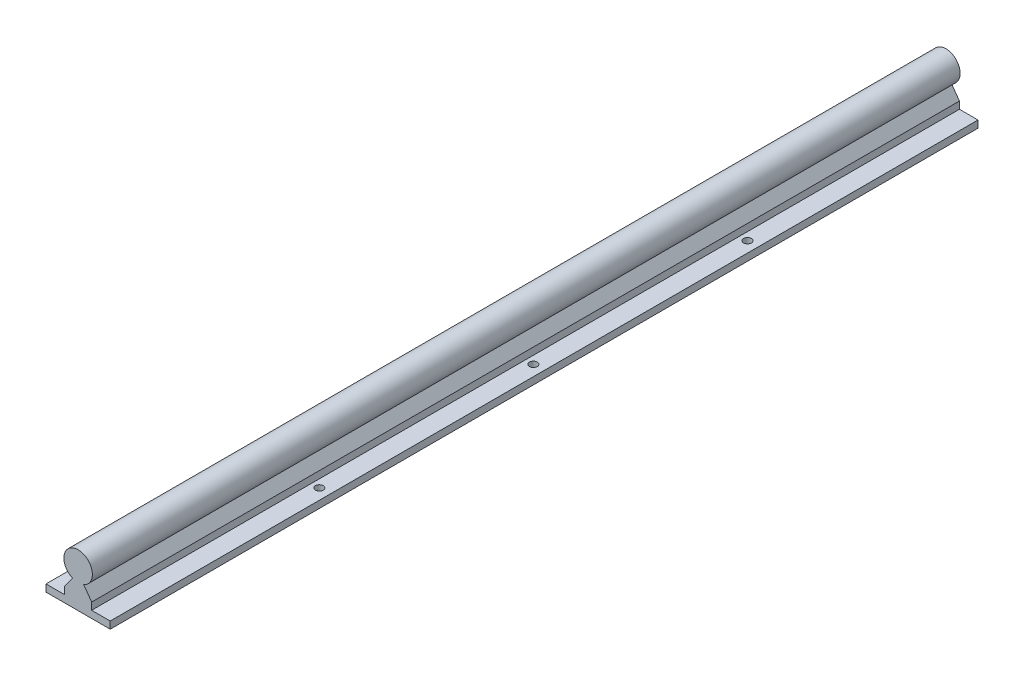
ISO-10303-21;
HEADER;
FILE_DESCRIPTION(('STEP AP214'),'2;1');
FILE_NAME('part.step','',(''),(''),'','','');
FILE_SCHEMA(('AUTOMOTIVE_DESIGN { 1 0 10303 214 1 1 1 1 }'));
ENDSEC;
DATA;
#1=APPLICATION_CONTEXT('core data for automotive mechanical design processes');
#2=APPLICATION_PROTOCOL_DEFINITION('international standard','automotive_design',2000,#1);
#3=PRODUCT_CONTEXT('',#1,'mechanical');
#4=PRODUCT('Part','Part','',(#3));
#5=PRODUCT_RELATED_PRODUCT_CATEGORY('part','',(#4));
#6=PRODUCT_DEFINITION_FORMATION('','',#4);
#7=PRODUCT_DEFINITION_CONTEXT('part definition',#1,'design');
#8=PRODUCT_DEFINITION('design','',#6,#7);
#9=PRODUCT_DEFINITION_SHAPE('','',#8);
#10=(LENGTH_UNIT() NAMED_UNIT(*) SI_UNIT(.MILLI.,.METRE.));
#11=(NAMED_UNIT(*) PLANE_ANGLE_UNIT() SI_UNIT($,.RADIAN.));
#12=(NAMED_UNIT(*) SI_UNIT($,.STERADIAN.) SOLID_ANGLE_UNIT());
#13=UNCERTAINTY_MEASURE_WITH_UNIT(LENGTH_MEASURE(1.E-05),#10,'distance_accuracy_value','');
#14=(GEOMETRIC_REPRESENTATION_CONTEXT(3) GLOBAL_UNCERTAINTY_ASSIGNED_CONTEXT((#13)) GLOBAL_UNIT_ASSIGNED_CONTEXT((#10,
#11,#12)) REPRESENTATION_CONTEXT('',''));
#15=CARTESIAN_POINT('',(0.,0.,0.));
#16=DIRECTION('',(0.,0.,1.));
#17=DIRECTION('',(1.,0.,0.));
#18=AXIS2_PLACEMENT_3D('',#15,#16,#17);
#19=CARTESIAN_POINT('',(0.,27.,608.));
#20=DIRECTION('',(0.,0.,-1.));
#21=DIRECTION('',(-1.,0.,0.));
#22=AXIS2_PLACEMENT_3D('',#19,#20,#21);
#23=CYLINDRICAL_SURFACE('',#22,10.);
#24=CARTESIAN_POINT('',(0.,27.,0.));
#25=DIRECTION('',(0.,0.,1.));
#26=DIRECTION('',(1.,0.,0.));
#27=AXIS2_PLACEMENT_3D('',#24,#25,#26);
#28=CIRCLE('',#27,10.);
#29=CARTESIAN_POINT('',(3.67559518989783,17.7,0.));
#30=VERTEX_POINT('',#29);
#31=CARTESIAN_POINT('',(-3.67559518989783,17.7,0.));
#32=VERTEX_POINT('',#31);
#33=EDGE_CURVE('E160',#30,#32,#28,.T.);
#34=ORIENTED_EDGE('',*,*,#33,.T.);
#35=DIRECTION('',(0.,0.,-1.));
#36=VECTOR('',#35,1.);
#37=CARTESIAN_POINT('',(-3.67559518989783,17.7,608.));
#38=LINE('',#37,#36);
#39=CARTESIAN_POINT('',(-3.67559518989783,17.7,608.));
#40=VERTEX_POINT('',#39);
#41=EDGE_CURVE('E11',#40,#32,#38,.T.);
#42=ORIENTED_EDGE('',*,*,#41,.F.);
#43=CARTESIAN_POINT('',(0.,27.,608.));
#44=DIRECTION('',(0.,0.,1.));
#45=DIRECTION('',(1.,0.,0.));
#46=AXIS2_PLACEMENT_3D('',#43,#44,#45);
#47=CIRCLE('',#46,10.);
#48=CARTESIAN_POINT('',(3.67559518989783,17.7,608.));
#49=VERTEX_POINT('',#48);
#50=EDGE_CURVE('E189',#49,#40,#47,.T.);
#51=ORIENTED_EDGE('',*,*,#50,.F.);
#52=DIRECTION('',(0.,0.,-1.));
#53=VECTOR('',#52,1.);
#54=CARTESIAN_POINT('',(3.67559518989783,17.7,608.));
#55=LINE('',#54,#53);
#56=EDGE_CURVE('E56',#49,#30,#55,.T.);
#57=ORIENTED_EDGE('',*,*,#56,.T.);
#58=EDGE_LOOP('',(#34,#42,#51,#57));
#59=FACE_BOUND('',#58,.T.);
#60=ADVANCED_FACE('F38',(#59),#23,.T.);
#61=CARTESIAN_POINT('',(0.,17.7,608.));
#62=DIRECTION('',(0.,-1.,0.));
#63=DIRECTION('',(0.,0.,-1.));
#64=AXIS2_PLACEMENT_3D('',#61,#62,#63);
#65=PLANE('',#64);
#66=DIRECTION('',(-1.,0.,0.));
#67=VECTOR('',#66,1.);
#68=CARTESIAN_POINT('',(0.,17.7,0.));
#69=LINE('',#68,#67);
#70=CARTESIAN_POINT('',(-4.,17.7,0.));
#71=VERTEX_POINT('',#70);
#72=EDGE_CURVE('E162',#32,#71,#69,.T.);
#73=ORIENTED_EDGE('',*,*,#72,.T.);
#74=DIRECTION('',(0.,0.,-1.));
#75=VECTOR('',#74,1.);
#76=CARTESIAN_POINT('',(-4.,17.7,608.));
#77=LINE('',#76,#75);
#78=CARTESIAN_POINT('',(-4.,17.7,608.));
#79=VERTEX_POINT('',#78);
#80=EDGE_CURVE('E47',#79,#71,#77,.T.);
#81=ORIENTED_EDGE('',*,*,#80,.F.);
#82=DIRECTION('',(-1.,0.,0.));
#83=VECTOR('',#82,1.);
#84=CARTESIAN_POINT('',(0.,17.7,608.));
#85=LINE('',#84,#83);
#86=EDGE_CURVE('E106',#40,#79,#85,.T.);
#87=ORIENTED_EDGE('',*,*,#86,.F.);
#88=ORIENTED_EDGE('',*,*,#41,.T.);
#89=EDGE_LOOP('',(#73,#81,#87,#88));
#90=FACE_BOUND('',#89,.T.);
#91=ADVANCED_FACE('F272',(#90),#65,.F.);
#92=CARTESIAN_POINT('',(-11.0202702702703,7.87162162162162,608.));
#93=DIRECTION('',(0.813733471206735,-0.581238193719096,0.));
#94=DIRECTION('',(0.581238193719096,0.813733471206735,0.));
#95=AXIS2_PLACEMENT_3D('',#92,#93,#94);
#96=PLANE('',#95);
#97=DIRECTION('',(-0.581238193719096,-0.813733471206735,0.));
#98=VECTOR('',#97,1.);
#99=CARTESIAN_POINT('',(-11.0202702702703,7.87162162162162,0.));
#100=LINE('',#99,#98);
#101=CARTESIAN_POINT('',(-9.5,10.,0.));
#102=VERTEX_POINT('',#101);
#103=EDGE_CURVE('E165',#71,#102,#100,.T.);
#104=ORIENTED_EDGE('',*,*,#103,.T.);
#105=DIRECTION('',(0.,0.,-1.));
#106=VECTOR('',#105,1.);
#107=CARTESIAN_POINT('',(-9.5,10.,608.));
#108=LINE('',#107,#106);
#109=CARTESIAN_POINT('',(-9.5,10.,608.));
#110=VERTEX_POINT('',#109);
#111=EDGE_CURVE('E205',#110,#102,#108,.T.);
#112=ORIENTED_EDGE('',*,*,#111,.F.);
#113=DIRECTION('',(-0.581238193719096,-0.813733471206735,0.));
#114=VECTOR('',#113,1.);
#115=CARTESIAN_POINT('',(-11.0202702702703,7.87162162162162,608.));
#116=LINE('',#115,#114);
#117=EDGE_CURVE('E235',#79,#110,#116,.T.);
#118=ORIENTED_EDGE('',*,*,#117,.F.);
#119=ORIENTED_EDGE('',*,*,#80,.T.);
#120=EDGE_LOOP('',(#104,#112,#118,#119));
#121=FACE_BOUND('',#120,.T.);
#122=ADVANCED_FACE('F276',(#121),#96,.F.);
#123=CARTESIAN_POINT('',(-9.5,0.,608.));
#124=DIRECTION('',(1.,0.,0.));
#125=DIRECTION('',(0.,1.,0.));
#126=AXIS2_PLACEMENT_3D('',#123,#124,#125);
#127=PLANE('',#126);
#128=DIRECTION('',(0.,-1.,0.));
#129=VECTOR('',#128,1.);
#130=CARTESIAN_POINT('',(-9.5,0.,0.));
#131=LINE('',#130,#129);
#132=CARTESIAN_POINT('',(-9.5,5.,0.));
#133=VERTEX_POINT('',#132);
#134=EDGE_CURVE('E167',#102,#133,#131,.T.);
#135=ORIENTED_EDGE('',*,*,#134,.T.);
#136=DIRECTION('',(0.,0.,-1.));
#137=VECTOR('',#136,1.);
#138=CARTESIAN_POINT('',(-9.5,5.,608.));
#139=LINE('',#138,#137);
#140=CARTESIAN_POINT('',(-9.5,5.,608.));
#141=VERTEX_POINT('',#140);
#142=EDGE_CURVE('E203',#141,#133,#139,.T.);
#143=ORIENTED_EDGE('',*,*,#142,.F.);
#144=DIRECTION('',(0.,-1.,0.));
#145=VECTOR('',#144,1.);
#146=CARTESIAN_POINT('',(-9.5,0.,608.));
#147=LINE('',#146,#145);
#148=EDGE_CURVE('E237',#110,#141,#147,.T.);
#149=ORIENTED_EDGE('',*,*,#148,.F.);
#150=ORIENTED_EDGE('',*,*,#111,.T.);
#151=EDGE_LOOP('',(#135,#143,#149,#150));
#152=FACE_BOUND('',#151,.T.);
#153=ADVANCED_FACE('F286',(#152),#127,.F.);
#154=CARTESIAN_POINT('',(0.,5.,608.));
#155=DIRECTION('',(0.,1.,0.));
#156=DIRECTION('',(-1.,0.,0.));
#157=AXIS2_PLACEMENT_3D('',#154,#155,#156);
#158=PLANE('',#157);
#159=CARTESIAN_POINT('',(-15.0000000000037,5.,154.));
#160=DIRECTION('',(0.,1.,0.));
#161=DIRECTION('',(-1.,0.,0.));
#162=AXIS2_PLACEMENT_3D('',#159,#160,#161);
#163=CIRCLE('',#162,2.75);
#164=CARTESIAN_POINT('',(-17.7500000000037,5.,154.));
#165=VERTEX_POINT('',#164);
#166=EDGE_CURVE('E163',#165,#165,#163,.F.);
#167=ORIENTED_EDGE('',*,*,#166,.T.);
#168=EDGE_LOOP('',(#167));
#169=FACE_BOUND('',#168,.T.);
#170=CARTESIAN_POINT('',(-15.0000000000032,5.,304.));
#171=DIRECTION('',(0.,1.,0.));
#172=DIRECTION('',(-1.,0.,0.));
#173=AXIS2_PLACEMENT_3D('',#170,#171,#172);
#174=CIRCLE('',#173,2.74999999999999);
#175=CARTESIAN_POINT('',(-17.7500000000032,5.,304.));
#176=VERTEX_POINT('',#175);
#177=EDGE_CURVE('E222',#176,#176,#174,.F.);
#178=ORIENTED_EDGE('',*,*,#177,.T.);
#179=EDGE_LOOP('',(#178));
#180=FACE_BOUND('',#179,.T.);
#181=CARTESIAN_POINT('',(-15.0000000000016,5.,454.));
#182=DIRECTION('',(0.,1.,0.));
#183=DIRECTION('',(-1.,0.,0.));
#184=AXIS2_PLACEMENT_3D('',#181,#182,#183);
#185=CIRCLE('',#184,2.74999999999997);
#186=CARTESIAN_POINT('',(-17.7500000000016,5.,454.));
#187=VERTEX_POINT('',#186);
#188=EDGE_CURVE('E218',#187,#187,#185,.F.);
#189=ORIENTED_EDGE('',*,*,#188,.T.);
#190=EDGE_LOOP('',(#189));
#191=FACE_BOUND('',#190,.T.);
#192=DIRECTION('',(1.,0.,0.));
#193=VECTOR('',#192,1.);
#194=CARTESIAN_POINT('',(0.,5.,0.));
#195=LINE('',#194,#193);
#196=CARTESIAN_POINT('',(-22.5,5.,0.));
#197=VERTEX_POINT('',#196);
#198=EDGE_CURVE('E170',#197,#133,#195,.T.);
#199=ORIENTED_EDGE('',*,*,#198,.F.);
#200=DIRECTION('',(0.,0.,-1.));
#201=VECTOR('',#200,1.);
#202=CARTESIAN_POINT('',(-22.5,5.,608.));
#203=LINE('',#202,#201);
#204=CARTESIAN_POINT('',(-22.5,5.,608.));
#205=VERTEX_POINT('',#204);
#206=EDGE_CURVE('E201',#205,#197,#203,.T.);
#207=ORIENTED_EDGE('',*,*,#206,.F.);
#208=DIRECTION('',(1.,0.,0.));
#209=VECTOR('',#208,1.);
#210=CARTESIAN_POINT('',(0.,5.,608.));
#211=LINE('',#210,#209);
#212=EDGE_CURVE('E239',#205,#141,#211,.T.);
#213=ORIENTED_EDGE('',*,*,#212,.T.);
#214=ORIENTED_EDGE('',*,*,#142,.T.);
#215=EDGE_LOOP('',(#199,#207,#213,#214));
#216=FACE_BOUND('',#215,.T.);
#217=ADVANCED_FACE('F304',(#169,#180,#191,#216),#158,.T.);
#218=CARTESIAN_POINT('',(-22.5,0.,608.));
#219=DIRECTION('',(-1.,0.,0.));
#220=DIRECTION('',(0.,0.,1.));
#221=AXIS2_PLACEMENT_3D('',#218,#219,#220);
#222=PLANE('',#221);
#223=DIRECTION('',(0.,1.,0.));
#224=VECTOR('',#223,1.);
#225=CARTESIAN_POINT('',(-22.5,0.,0.));
#226=LINE('',#225,#224);
#227=CARTESIAN_POINT('',(-22.5,0.,0.));
#228=VERTEX_POINT('',#227);
#229=EDGE_CURVE('E173',#228,#197,#226,.T.);
#230=ORIENTED_EDGE('',*,*,#229,.F.);
#231=DIRECTION('',(0.,0.,-1.));
#232=VECTOR('',#231,1.);
#233=CARTESIAN_POINT('',(-22.5,0.,608.));
#234=LINE('',#233,#232);
#235=CARTESIAN_POINT('',(-22.5,0.,608.));
#236=VERTEX_POINT('',#235);
#237=EDGE_CURVE('E199',#236,#228,#234,.T.);
#238=ORIENTED_EDGE('',*,*,#237,.F.);
#239=DIRECTION('',(0.,1.,0.));
#240=VECTOR('',#239,1.);
#241=CARTESIAN_POINT('',(-22.5,0.,608.));
#242=LINE('',#241,#240);
#243=EDGE_CURVE('E242',#236,#205,#242,.T.);
#244=ORIENTED_EDGE('',*,*,#243,.T.);
#245=ORIENTED_EDGE('',*,*,#206,.T.);
#246=EDGE_LOOP('',(#230,#238,#244,#245));
#247=FACE_BOUND('',#246,.T.);
#248=ADVANCED_FACE('F292',(#247),#222,.T.);
#249=CARTESIAN_POINT('',(0.,0.,608.));
#250=DIRECTION('',(0.,1.,0.));
#251=DIRECTION('',(0.,0.,1.));
#252=AXIS2_PLACEMENT_3D('',#249,#250,#251);
#253=PLANE('',#252);
#254=CARTESIAN_POINT('',(14.9999999999968,0.,304.));
#255=DIRECTION('',(0.,1.,0.));
#256=DIRECTION('',(0.,0.,1.));
#257=AXIS2_PLACEMENT_3D('',#254,#255,#256);
#258=CIRCLE('',#257,2.75000000000003);
#259=CARTESIAN_POINT('',(14.9999999999968,0.,306.75));
#260=VERTEX_POINT('',#259);
#261=EDGE_CURVE('E466',#260,#260,#258,.T.);
#262=ORIENTED_EDGE('',*,*,#261,.T.);
#263=EDGE_LOOP('',(#262));
#264=FACE_BOUND('',#263,.T.);
#265=CARTESIAN_POINT('',(14.9999999999963,0.,154.));
#266=DIRECTION('',(0.,1.,0.));
#267=DIRECTION('',(0.,0.,1.));
#268=AXIS2_PLACEMENT_3D('',#265,#266,#267);
#269=CIRCLE('',#268,2.75000000000002);
#270=CARTESIAN_POINT('',(14.9999999999963,0.,156.75));
#271=VERTEX_POINT('',#270);
#272=EDGE_CURVE('E460',#271,#271,#269,.T.);
#273=ORIENTED_EDGE('',*,*,#272,.T.);
#274=EDGE_LOOP('',(#273));
#275=FACE_BOUND('',#274,.T.);
#276=CARTESIAN_POINT('',(-15.0000000000037,0.,154.));
#277=DIRECTION('',(0.,1.,0.));
#278=DIRECTION('',(0.,0.,1.));
#279=AXIS2_PLACEMENT_3D('',#276,#277,#278);
#280=CIRCLE('',#279,2.75);
#281=CARTESIAN_POINT('',(-15.0000000000037,0.,156.75));
#282=VERTEX_POINT('',#281);
#283=EDGE_CURVE('E457',#282,#282,#280,.T.);
#284=ORIENTED_EDGE('',*,*,#283,.T.);
#285=EDGE_LOOP('',(#284));
#286=FACE_BOUND('',#285,.T.);
#287=CARTESIAN_POINT('',(-15.0000000000032,0.,304.));
#288=DIRECTION('',(0.,1.,0.));
#289=DIRECTION('',(0.,0.,1.));
#290=AXIS2_PLACEMENT_3D('',#287,#288,#289);
#291=CIRCLE('',#290,2.74999999999999);
#292=CARTESIAN_POINT('',(-15.0000000000032,0.,306.75));
#293=VERTEX_POINT('',#292);
#294=EDGE_CURVE('E459',#293,#293,#291,.T.);
#295=ORIENTED_EDGE('',*,*,#294,.T.);
#296=EDGE_LOOP('',(#295));
#297=FACE_BOUND('',#296,.T.);
#298=CARTESIAN_POINT('',(-15.0000000000016,0.,454.));
#299=DIRECTION('',(0.,1.,0.));
#300=DIRECTION('',(0.,0.,1.));
#301=AXIS2_PLACEMENT_3D('',#298,#299,#300);
#302=CIRCLE('',#301,2.74999999999997);
#303=CARTESIAN_POINT('',(-15.0000000000016,0.,456.75));
#304=VERTEX_POINT('',#303);
#305=EDGE_CURVE('E463',#304,#304,#302,.T.);
#306=ORIENTED_EDGE('',*,*,#305,.T.);
#307=EDGE_LOOP('',(#306));
#308=FACE_BOUND('',#307,.T.);
#309=CARTESIAN_POINT('',(14.9999999999984,0.,454.));
#310=DIRECTION('',(0.,1.,0.));
#311=DIRECTION('',(0.,0.,1.));
#312=AXIS2_PLACEMENT_3D('',#309,#310,#311);
#313=CIRCLE('',#312,2.74999999999998);
#314=CARTESIAN_POINT('',(14.9999999999984,0.,456.75));
#315=VERTEX_POINT('',#314);
#316=EDGE_CURVE('E213',#315,#315,#313,.T.);
#317=ORIENTED_EDGE('',*,*,#316,.T.);
#318=EDGE_LOOP('',(#317));
#319=FACE_BOUND('',#318,.T.);
#320=DIRECTION('',(1.,0.,0.));
#321=VECTOR('',#320,1.);
#322=CARTESIAN_POINT('',(0.,0.,0.));
#323=LINE('',#322,#321);
#324=CARTESIAN_POINT('',(22.5,0.,0.));
#325=VERTEX_POINT('',#324);
#326=EDGE_CURVE('E176',#228,#325,#323,.T.);
#327=ORIENTED_EDGE('',*,*,#326,.T.);
#328=DIRECTION('',(0.,0.,-1.));
#329=VECTOR('',#328,1.);
#330=CARTESIAN_POINT('',(22.5,0.,608.));
#331=LINE('',#330,#329);
#332=CARTESIAN_POINT('',(22.5,0.,608.));
#333=VERTEX_POINT('',#332);
#334=EDGE_CURVE('E196',#333,#325,#331,.T.);
#335=ORIENTED_EDGE('',*,*,#334,.F.);
#336=DIRECTION('',(1.,0.,0.));
#337=VECTOR('',#336,1.);
#338=CARTESIAN_POINT('',(0.,0.,608.));
#339=LINE('',#338,#337);
#340=EDGE_CURVE('E245',#236,#333,#339,.T.);
#341=ORIENTED_EDGE('',*,*,#340,.F.);
#342=ORIENTED_EDGE('',*,*,#237,.T.);
#343=EDGE_LOOP('',(#327,#335,#341,#342));
#344=FACE_BOUND('',#343,.T.);
#345=ADVANCED_FACE('F295',(#264,#275,#286,#297,#308,#319,#344),#253,.F.);
#346=CARTESIAN_POINT('',(22.5,0.,608.));
#347=DIRECTION('',(-1.,0.,0.));
#348=DIRECTION('',(0.,0.,1.));
#349=AXIS2_PLACEMENT_3D('',#346,#347,#348);
#350=PLANE('',#349);
#351=DIRECTION('',(0.,1.,0.));
#352=VECTOR('',#351,1.);
#353=CARTESIAN_POINT('',(22.5,0.,0.));
#354=LINE('',#353,#352);
#355=CARTESIAN_POINT('',(22.5,5.,0.));
#356=VERTEX_POINT('',#355);
#357=EDGE_CURVE('E178',#325,#356,#354,.T.);
#358=ORIENTED_EDGE('',*,*,#357,.T.);
#359=DIRECTION('',(0.,0.,-1.));
#360=VECTOR('',#359,1.);
#361=CARTESIAN_POINT('',(22.5,5.,608.));
#362=LINE('',#361,#360);
#363=CARTESIAN_POINT('',(22.5,5.,608.));
#364=VERTEX_POINT('',#363);
#365=EDGE_CURVE('E193',#364,#356,#362,.T.);
#366=ORIENTED_EDGE('',*,*,#365,.F.);
#367=DIRECTION('',(0.,1.,0.));
#368=VECTOR('',#367,1.);
#369=CARTESIAN_POINT('',(22.5,0.,608.));
#370=LINE('',#369,#368);
#371=EDGE_CURVE('E247',#333,#364,#370,.T.);
#372=ORIENTED_EDGE('',*,*,#371,.F.);
#373=ORIENTED_EDGE('',*,*,#334,.T.);
#374=EDGE_LOOP('',(#358,#366,#372,#373));
#375=FACE_BOUND('',#374,.T.);
#376=ADVANCED_FACE('F254',(#375),#350,.F.);
#377=CARTESIAN_POINT('',(0.,5.,608.));
#378=DIRECTION('',(0.,-1.,0.));
#379=DIRECTION('',(1.,0.,0.));
#380=AXIS2_PLACEMENT_3D('',#377,#378,#379);
#381=PLANE('',#380);
#382=CARTESIAN_POINT('',(14.9999999999968,5.,304.));
#383=DIRECTION('',(0.,-1.,0.));
#384=DIRECTION('',(1.,0.,0.));
#385=AXIS2_PLACEMENT_3D('',#382,#383,#384);
#386=CIRCLE('',#385,2.75000000000003);
#387=CARTESIAN_POINT('',(17.7499999999968,5.,304.));
#388=VERTEX_POINT('',#387);
#389=EDGE_CURVE('E41',#388,#388,#386,.F.);
#390=ORIENTED_EDGE('',*,*,#389,.F.);
#391=EDGE_LOOP('',(#390));
#392=FACE_BOUND('',#391,.T.);
#393=CARTESIAN_POINT('',(14.9999999999963,5.,154.));
#394=DIRECTION('',(0.,-1.,0.));
#395=DIRECTION('',(1.,0.,0.));
#396=AXIS2_PLACEMENT_3D('',#393,#394,#395);
#397=CIRCLE('',#396,2.75000000000002);
#398=CARTESIAN_POINT('',(17.7499999999963,5.,154.));
#399=VERTEX_POINT('',#398);
#400=EDGE_CURVE('E212',#399,#399,#397,.F.);
#401=ORIENTED_EDGE('',*,*,#400,.F.);
#402=EDGE_LOOP('',(#401));
#403=FACE_BOUND('',#402,.T.);
#404=CARTESIAN_POINT('',(14.9999999999984,5.,454.));
#405=DIRECTION('',(0.,-1.,0.));
#406=DIRECTION('',(1.,0.,0.));
#407=AXIS2_PLACEMENT_3D('',#404,#405,#406);
#408=CIRCLE('',#407,2.74999999999998);
#409=CARTESIAN_POINT('',(17.7499999999983,5.,454.));
#410=VERTEX_POINT('',#409);
#411=EDGE_CURVE('E210',#410,#410,#408,.F.);
#412=ORIENTED_EDGE('',*,*,#411,.F.);
#413=EDGE_LOOP('',(#412));
#414=FACE_BOUND('',#413,.T.);
#415=DIRECTION('',(-1.,0.,0.));
#416=VECTOR('',#415,1.);
#417=CARTESIAN_POINT('',(0.,5.,0.));
#418=LINE('',#417,#416);
#419=CARTESIAN_POINT('',(9.5,5.,0.));
#420=VERTEX_POINT('',#419);
#421=EDGE_CURVE('E180',#356,#420,#418,.T.);
#422=ORIENTED_EDGE('',*,*,#421,.T.);
#423=DIRECTION('',(0.,0.,-1.));
#424=VECTOR('',#423,1.);
#425=CARTESIAN_POINT('',(9.5,5.,608.));
#426=LINE('',#425,#424);
#427=CARTESIAN_POINT('',(9.5,5.,608.));
#428=VERTEX_POINT('',#427);
#429=EDGE_CURVE('E143',#428,#420,#426,.T.);
#430=ORIENTED_EDGE('',*,*,#429,.F.);
#431=DIRECTION('',(-1.,0.,0.));
#432=VECTOR('',#431,1.);
#433=CARTESIAN_POINT('',(0.,5.,608.));
#434=LINE('',#433,#432);
#435=EDGE_CURVE('E151',#364,#428,#434,.T.);
#436=ORIENTED_EDGE('',*,*,#435,.F.);
#437=ORIENTED_EDGE('',*,*,#365,.T.);
#438=EDGE_LOOP('',(#422,#430,#436,#437));
#439=FACE_BOUND('',#438,.T.);
#440=ADVANCED_FACE('F258',(#392,#403,#414,#439),#381,.F.);
#441=CARTESIAN_POINT('',(9.5,0.,608.));
#442=DIRECTION('',(1.,0.,0.));
#443=DIRECTION('',(0.,1.,0.));
#444=AXIS2_PLACEMENT_3D('',#441,#442,#443);
#445=PLANE('',#444);
#446=DIRECTION('',(0.,-1.,0.));
#447=VECTOR('',#446,1.);
#448=CARTESIAN_POINT('',(9.5,0.,0.));
#449=LINE('',#448,#447);
#450=CARTESIAN_POINT('',(9.5,10.,0.));
#451=VERTEX_POINT('',#450);
#452=EDGE_CURVE('E139',#451,#420,#449,.T.);
#453=ORIENTED_EDGE('',*,*,#452,.F.);
#454=DIRECTION('',(0.,0.,-1.));
#455=VECTOR('',#454,1.);
#456=CARTESIAN_POINT('',(9.5,10.,608.));
#457=LINE('',#456,#455);
#458=CARTESIAN_POINT('',(9.5,10.,608.));
#459=VERTEX_POINT('',#458);
#460=EDGE_CURVE('E134',#459,#451,#457,.T.);
#461=ORIENTED_EDGE('',*,*,#460,.F.);
#462=DIRECTION('',(0.,-1.,0.));
#463=VECTOR('',#462,1.);
#464=CARTESIAN_POINT('',(9.5,0.,608.));
#465=LINE('',#464,#463);
#466=EDGE_CURVE('E137',#459,#428,#465,.T.);
#467=ORIENTED_EDGE('',*,*,#466,.T.);
#468=ORIENTED_EDGE('',*,*,#429,.T.);
#469=EDGE_LOOP('',(#453,#461,#467,#468));
#470=FACE_BOUND('',#469,.T.);
#471=ADVANCED_FACE('F136',(#470),#445,.T.);
#472=CARTESIAN_POINT('',(11.0202702702703,7.87162162162162,608.));
#473=DIRECTION('',(0.813733471206735,0.581238193719096,0.));
#474=DIRECTION('',(-0.581238193719096,0.813733471206735,0.));
#475=AXIS2_PLACEMENT_3D('',#472,#473,#474);
#476=PLANE('',#475);
#477=DIRECTION('',(0.581238193719096,-0.813733471206735,0.));
#478=VECTOR('',#477,1.);
#479=CARTESIAN_POINT('',(11.0202702702703,7.87162162162162,0.));
#480=LINE('',#479,#478);
#481=CARTESIAN_POINT('',(4.,17.7,0.));
#482=VERTEX_POINT('',#481);
#483=EDGE_CURVE('E184',#482,#451,#480,.T.);
#484=ORIENTED_EDGE('',*,*,#483,.F.);
#485=DIRECTION('',(0.,0.,-1.));
#486=VECTOR('',#485,1.);
#487=CARTESIAN_POINT('',(4.,17.7,608.));
#488=LINE('',#487,#486);
#489=CARTESIAN_POINT('',(4.,17.7,608.));
#490=VERTEX_POINT('',#489);
#491=EDGE_CURVE('E94',#490,#482,#488,.T.);
#492=ORIENTED_EDGE('',*,*,#491,.F.);
#493=DIRECTION('',(0.581238193719096,-0.813733471206735,0.));
#494=VECTOR('',#493,1.);
#495=CARTESIAN_POINT('',(11.0202702702703,7.87162162162162,608.));
#496=LINE('',#495,#494);
#497=EDGE_CURVE('E149',#490,#459,#496,.T.);
#498=ORIENTED_EDGE('',*,*,#497,.T.);
#499=ORIENTED_EDGE('',*,*,#460,.T.);
#500=EDGE_LOOP('',(#484,#492,#498,#499));
#501=FACE_BOUND('',#500,.T.);
#502=ADVANCED_FACE('F154',(#501),#476,.T.);
#503=CARTESIAN_POINT('',(0.,17.7,608.));
#504=DIRECTION('',(0.,1.,0.));
#505=DIRECTION('',(0.,0.,1.));
#506=AXIS2_PLACEMENT_3D('',#503,#504,#505);
#507=PLANE('',#506);
#508=DIRECTION('',(1.,0.,0.));
#509=VECTOR('',#508,1.);
#510=CARTESIAN_POINT('',(0.,17.7,0.));
#511=LINE('',#510,#509);
#512=EDGE_CURVE('E186',#30,#482,#511,.T.);
#513=ORIENTED_EDGE('',*,*,#512,.F.);
#514=ORIENTED_EDGE('',*,*,#56,.F.);
#515=DIRECTION('',(1.,0.,0.));
#516=VECTOR('',#515,1.);
#517=CARTESIAN_POINT('',(0.,17.7,608.));
#518=LINE('',#517,#516);
#519=EDGE_CURVE('E155',#49,#490,#518,.T.);
#520=ORIENTED_EDGE('',*,*,#519,.T.);
#521=ORIENTED_EDGE('',*,*,#491,.T.);
#522=EDGE_LOOP('',(#513,#514,#520,#521));
#523=FACE_BOUND('',#522,.T.);
#524=ADVANCED_FACE('F261',(#523),#507,.T.);
#525=CARTESIAN_POINT('',(0.,0.,608.));
#526=DIRECTION('',(0.,0.,1.));
#527=DIRECTION('',(1.,0.,0.));
#528=AXIS2_PLACEMENT_3D('',#525,#526,#527);
#529=PLANE('',#528);
#530=ORIENTED_EDGE('',*,*,#50,.T.);
#531=ORIENTED_EDGE('',*,*,#86,.T.);
#532=ORIENTED_EDGE('',*,*,#117,.T.);
#533=ORIENTED_EDGE('',*,*,#148,.T.);
#534=ORIENTED_EDGE('',*,*,#212,.F.);
#535=ORIENTED_EDGE('',*,*,#243,.F.);
#536=ORIENTED_EDGE('',*,*,#340,.T.);
#537=ORIENTED_EDGE('',*,*,#371,.T.);
#538=ORIENTED_EDGE('',*,*,#435,.T.);
#539=ORIENTED_EDGE('',*,*,#466,.F.);
#540=ORIENTED_EDGE('',*,*,#497,.F.);
#541=ORIENTED_EDGE('',*,*,#519,.F.);
#542=EDGE_LOOP('',(#530,#531,#532,#533,#534,#535,#536,#537,#538,#539,#540,#541));
#543=FACE_BOUND('',#542,.T.);
#544=ADVANCED_FACE('F147',(#543),#529,.T.);
#545=CARTESIAN_POINT('',(0.,0.,0.));
#546=DIRECTION('',(0.,0.,1.));
#547=DIRECTION('',(1.,0.,0.));
#548=AXIS2_PLACEMENT_3D('',#545,#546,#547);
#549=PLANE('',#548);
#550=ORIENTED_EDGE('',*,*,#33,.F.);
#551=ORIENTED_EDGE('',*,*,#512,.T.);
#552=ORIENTED_EDGE('',*,*,#483,.T.);
#553=ORIENTED_EDGE('',*,*,#452,.T.);
#554=ORIENTED_EDGE('',*,*,#421,.F.);
#555=ORIENTED_EDGE('',*,*,#357,.F.);
#556=ORIENTED_EDGE('',*,*,#326,.F.);
#557=ORIENTED_EDGE('',*,*,#229,.T.);
#558=ORIENTED_EDGE('',*,*,#198,.T.);
#559=ORIENTED_EDGE('',*,*,#134,.F.);
#560=ORIENTED_EDGE('',*,*,#103,.F.);
#561=ORIENTED_EDGE('',*,*,#72,.F.);
#562=EDGE_LOOP('',(#550,#551,#552,#553,#554,#555,#556,#557,#558,#559,#560,#561));
#563=FACE_BOUND('',#562,.T.);
#564=ADVANCED_FACE('F260',(#563),#549,.F.);
#565=CARTESIAN_POINT('',(14.9999999999984,450.,454.));
#566=DIRECTION('',(0.,-1.,0.));
#567=DIRECTION('',(0.,0.,-1.));
#568=AXIS2_PLACEMENT_3D('',#565,#566,#567);
#569=CYLINDRICAL_SURFACE('',#568,2.74999999999998);
#570=ORIENTED_EDGE('',*,*,#316,.F.);
#571=EDGE_LOOP('',(#570));
#572=FACE_BOUND('',#571,.T.);
#573=ORIENTED_EDGE('',*,*,#411,.T.);
#574=EDGE_LOOP('',(#573));
#575=FACE_BOUND('',#574,.T.);
#576=ADVANCED_FACE('F376',(#572,#575),#569,.F.);
#577=CARTESIAN_POINT('',(14.9999999999963,450.,154.));
#578=DIRECTION('',(0.,-1.,0.));
#579=DIRECTION('',(0.,0.,-1.));
#580=AXIS2_PLACEMENT_3D('',#577,#578,#579);
#581=CYLINDRICAL_SURFACE('',#580,2.75000000000002);
#582=ORIENTED_EDGE('',*,*,#272,.F.);
#583=EDGE_LOOP('',(#582));
#584=FACE_BOUND('',#583,.T.);
#585=ORIENTED_EDGE('',*,*,#400,.T.);
#586=EDGE_LOOP('',(#585));
#587=FACE_BOUND('',#586,.T.);
#588=ADVANCED_FACE('F386',(#584,#587),#581,.F.);
#589=CARTESIAN_POINT('',(14.9999999999968,450.,304.));
#590=DIRECTION('',(0.,-1.,0.));
#591=DIRECTION('',(0.,0.,-1.));
#592=AXIS2_PLACEMENT_3D('',#589,#590,#591);
#593=CYLINDRICAL_SURFACE('',#592,2.75000000000003);
#594=ORIENTED_EDGE('',*,*,#261,.F.);
#595=EDGE_LOOP('',(#594));
#596=FACE_BOUND('',#595,.T.);
#597=ORIENTED_EDGE('',*,*,#389,.T.);
#598=EDGE_LOOP('',(#597));
#599=FACE_BOUND('',#598,.T.);
#600=ADVANCED_FACE('F395',(#596,#599),#593,.F.);
#601=CARTESIAN_POINT('',(-15.0000000000016,450.,454.));
#602=DIRECTION('',(0.,-1.,0.));
#603=DIRECTION('',(0.,0.,-1.));
#604=AXIS2_PLACEMENT_3D('',#601,#602,#603);
#605=CYLINDRICAL_SURFACE('',#604,2.74999999999997);
#606=ORIENTED_EDGE('',*,*,#188,.F.);
#607=EDGE_LOOP('',(#606));
#608=FACE_BOUND('',#607,.T.);
#609=ORIENTED_EDGE('',*,*,#305,.F.);
#610=EDGE_LOOP('',(#609));
#611=FACE_BOUND('',#610,.T.);
#612=ADVANCED_FACE('F403',(#608,#611),#605,.F.);
#613=CARTESIAN_POINT('',(-15.0000000000032,450.,304.));
#614=DIRECTION('',(0.,-1.,0.));
#615=DIRECTION('',(0.,0.,-1.));
#616=AXIS2_PLACEMENT_3D('',#613,#614,#615);
#617=CYLINDRICAL_SURFACE('',#616,2.74999999999999);
#618=ORIENTED_EDGE('',*,*,#177,.F.);
#619=EDGE_LOOP('',(#618));
#620=FACE_BOUND('',#619,.T.);
#621=ORIENTED_EDGE('',*,*,#294,.F.);
#622=EDGE_LOOP('',(#621));
#623=FACE_BOUND('',#622,.T.);
#624=ADVANCED_FACE('F411',(#620,#623),#617,.F.);
#625=CARTESIAN_POINT('',(-15.0000000000037,450.,154.));
#626=DIRECTION('',(0.,-1.,0.));
#627=DIRECTION('',(0.,0.,-1.));
#628=AXIS2_PLACEMENT_3D('',#625,#626,#627);
#629=CYLINDRICAL_SURFACE('',#628,2.75);
#630=ORIENTED_EDGE('',*,*,#166,.F.);
#631=EDGE_LOOP('',(#630));
#632=FACE_BOUND('',#631,.T.);
#633=ORIENTED_EDGE('',*,*,#283,.F.);
#634=EDGE_LOOP('',(#633));
#635=FACE_BOUND('',#634,.T.);
#636=ADVANCED_FACE('F419',(#632,#635),#629,.F.);
#637=CLOSED_SHELL('',(#60,#91,#122,#153,#217,#248,#345,#376,#440,#471,#502,#524,#544,#564,#576,
#588,#600,#612,#624,#636));
#638=MANIFOLD_SOLID_BREP('B2',#637);
#639=ADVANCED_BREP_SHAPE_REPRESENTATION('',(#18,#638),#14);
#640=SHAPE_DEFINITION_REPRESENTATION(#9,#639);
ENDSEC;
END-ISO-10303-21;
